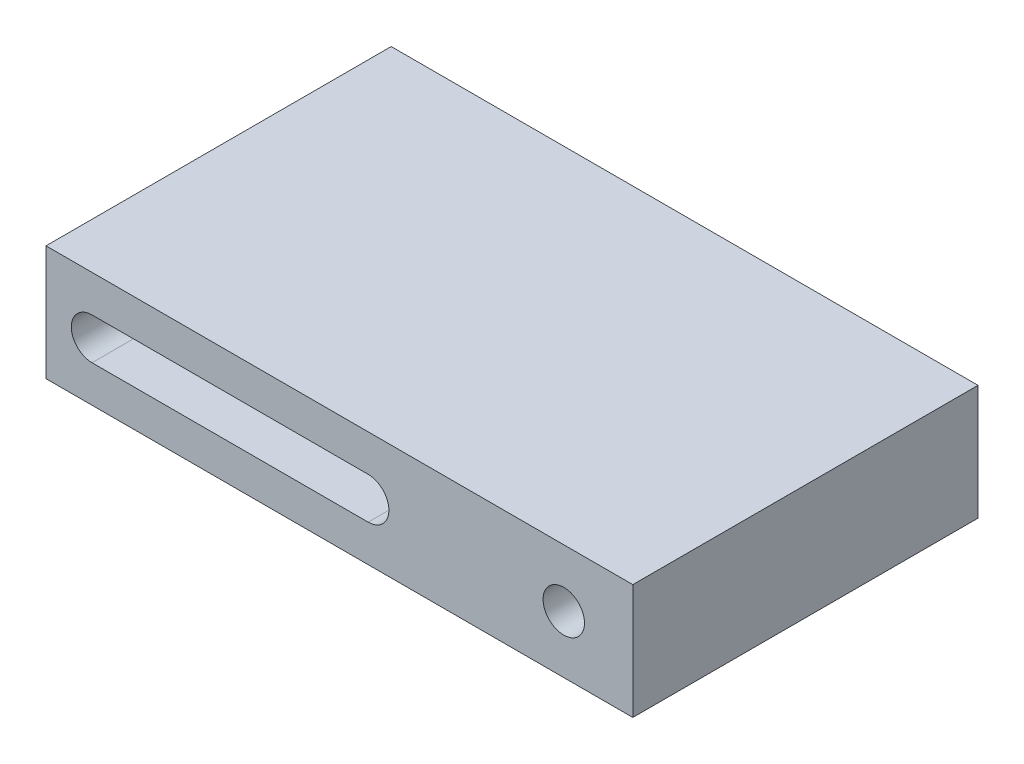
ISO-10303-21;
HEADER;
FILE_DESCRIPTION(('STEP AP214'),'2;1');
FILE_NAME('part.step','',(''),(''),'','','');
FILE_SCHEMA(('AUTOMOTIVE_DESIGN { 1 0 10303 214 1 1 1 1 }'));
ENDSEC;
DATA;
#1=APPLICATION_CONTEXT('core data for automotive mechanical design processes');
#2=APPLICATION_PROTOCOL_DEFINITION('international standard','automotive_design',2000,#1);
#3=PRODUCT_CONTEXT('',#1,'mechanical');
#4=PRODUCT('Part','Part','',(#3));
#5=PRODUCT_RELATED_PRODUCT_CATEGORY('part','',(#4));
#6=PRODUCT_DEFINITION_FORMATION('','',#4);
#7=PRODUCT_DEFINITION_CONTEXT('part definition',#1,'design');
#8=PRODUCT_DEFINITION('design','',#6,#7);
#9=PRODUCT_DEFINITION_SHAPE('','',#8);
#10=(LENGTH_UNIT() NAMED_UNIT(*) SI_UNIT(.MILLI.,.METRE.));
#11=(NAMED_UNIT(*) PLANE_ANGLE_UNIT() SI_UNIT($,.RADIAN.));
#12=(NAMED_UNIT(*) SI_UNIT($,.STERADIAN.) SOLID_ANGLE_UNIT());
#13=UNCERTAINTY_MEASURE_WITH_UNIT(LENGTH_MEASURE(1.E-05),#10,'distance_accuracy_value','');
#14=(GEOMETRIC_REPRESENTATION_CONTEXT(3) GLOBAL_UNCERTAINTY_ASSIGNED_CONTEXT((#13)) GLOBAL_UNIT_ASSIGNED_CONTEXT((#10,
#11,#12)) REPRESENTATION_CONTEXT('',''));
#15=CARTESIAN_POINT('',(0.,0.,0.));
#16=DIRECTION('',(0.,0.,1.));
#17=DIRECTION('',(1.,0.,0.));
#18=AXIS2_PLACEMENT_3D('',#15,#16,#17);
#19=CARTESIAN_POINT('',(1275.,500.,-750.));
#20=DIRECTION('',(-1.,0.,0.));
#21=DIRECTION('',(0.,0.,1.));
#22=AXIS2_PLACEMENT_3D('',#19,#20,#21);
#23=PLANE('',#22);
#24=DIRECTION('',(0.,0.,-1.));
#25=VECTOR('',#24,1.);
#26=CARTESIAN_POINT('',(1275.,0.,-750.));
#27=LINE('',#26,#25);
#28=CARTESIAN_POINT('',(1275.,0.,750.));
#29=VERTEX_POINT('',#28);
#30=CARTESIAN_POINT('',(1275.,0.,-750.));
#31=VERTEX_POINT('',#30);
#32=EDGE_CURVE('E135',#29,#31,#27,.T.);
#33=ORIENTED_EDGE('',*,*,#32,.T.);
#34=DIRECTION('',(0.,-1.,0.));
#35=VECTOR('',#34,1.);
#36=CARTESIAN_POINT('',(1275.,500.,-750.));
#37=LINE('',#36,#35);
#38=CARTESIAN_POINT('',(1275.,500.,-750.));
#39=VERTEX_POINT('',#38);
#40=EDGE_CURVE('E11',#39,#31,#37,.T.);
#41=ORIENTED_EDGE('',*,*,#40,.F.);
#42=DIRECTION('',(0.,0.,-1.));
#43=VECTOR('',#42,1.);
#44=CARTESIAN_POINT('',(1275.,500.,-750.));
#45=LINE('',#44,#43);
#46=CARTESIAN_POINT('',(1275.,500.,750.));
#47=VERTEX_POINT('',#46);
#48=EDGE_CURVE('E144',#47,#39,#45,.T.);
#49=ORIENTED_EDGE('',*,*,#48,.F.);
#50=DIRECTION('',(0.,-1.,0.));
#51=VECTOR('',#50,1.);
#52=CARTESIAN_POINT('',(1275.,500.,750.));
#53=LINE('',#52,#51);
#54=EDGE_CURVE('E154',#47,#29,#53,.T.);
#55=ORIENTED_EDGE('',*,*,#54,.T.);
#56=EDGE_LOOP('',(#33,#41,#49,#55));
#57=FACE_BOUND('',#56,.T.);
#58=ADVANCED_FACE('F37',(#57),#23,.F.);
#59=CARTESIAN_POINT('',(-1275.,500.,-750.));
#60=DIRECTION('',(0.,0.,1.));
#61=DIRECTION('',(1.,0.,0.));
#62=AXIS2_PLACEMENT_3D('',#59,#60,#61);
#63=PLANE('',#62);
#64=DIRECTION('',(-1.,0.,0.));
#65=VECTOR('',#64,1.);
#66=CARTESIAN_POINT('',(-1075.,340.,-750.));
#67=LINE('',#66,#65);
#68=CARTESIAN_POINT('',(125.,340.,-750.));
#69=VERTEX_POINT('',#68);
#70=CARTESIAN_POINT('',(-1075.,340.,-750.));
#71=VERTEX_POINT('',#70);
#72=EDGE_CURVE('E109',#69,#71,#67,.T.);
#73=ORIENTED_EDGE('',*,*,#72,.T.);
#74=CARTESIAN_POINT('',(-1075.,250.,-750.));
#75=DIRECTION('',(0.,0.,1.));
#76=DIRECTION('',(1.,0.,0.));
#77=AXIS2_PLACEMENT_3D('',#74,#75,#76);
#78=CIRCLE('',#77,90.);
#79=CARTESIAN_POINT('',(-1075.,160.,-750.));
#80=VERTEX_POINT('',#79);
#81=EDGE_CURVE('E103',#71,#80,#78,.T.);
#82=ORIENTED_EDGE('',*,*,#81,.T.);
#83=DIRECTION('',(1.,0.,0.));
#84=VECTOR('',#83,1.);
#85=CARTESIAN_POINT('',(-1075.,160.,-750.));
#86=LINE('',#85,#84);
#87=CARTESIAN_POINT('',(125.,160.,-750.));
#88=VERTEX_POINT('',#87);
#89=EDGE_CURVE('E112',#80,#88,#86,.T.);
#90=ORIENTED_EDGE('',*,*,#89,.T.);
#91=CARTESIAN_POINT('',(125.,250.,-750.));
#92=DIRECTION('',(0.,0.,1.));
#93=DIRECTION('',(1.,0.,0.));
#94=AXIS2_PLACEMENT_3D('',#91,#92,#93);
#95=CIRCLE('',#94,90.);
#96=EDGE_CURVE('E51',#88,#69,#95,.T.);
#97=ORIENTED_EDGE('',*,*,#96,.T.);
#98=EDGE_LOOP('',(#73,#82,#90,#97));
#99=FACE_BOUND('',#98,.T.);
#100=CARTESIAN_POINT('',(975.,250.,-750.));
#101=DIRECTION('',(0.,0.,1.));
#102=DIRECTION('',(1.,0.,0.));
#103=AXIS2_PLACEMENT_3D('',#100,#101,#102);
#104=CIRCLE('',#103,90.0000000000002);
#105=CARTESIAN_POINT('',(1065.,250.,-750.));
#106=VERTEX_POINT('',#105);
#107=EDGE_CURVE('E141',#106,#106,#104,.T.);
#108=ORIENTED_EDGE('',*,*,#107,.T.);
#109=EDGE_LOOP('',(#108));
#110=FACE_BOUND('',#109,.T.);
#111=DIRECTION('',(-1.,0.,0.));
#112=VECTOR('',#111,1.);
#113=CARTESIAN_POINT('',(-1275.,0.,-750.));
#114=LINE('',#113,#112);
#115=CARTESIAN_POINT('',(-1275.,0.,-750.));
#116=VERTEX_POINT('',#115);
#117=EDGE_CURVE('E157',#31,#116,#114,.T.);
#118=ORIENTED_EDGE('',*,*,#117,.T.);
#119=DIRECTION('',(0.,-1.,0.));
#120=VECTOR('',#119,1.);
#121=CARTESIAN_POINT('',(-1275.,500.,-750.));
#122=LINE('',#121,#120);
#123=CARTESIAN_POINT('',(-1275.,500.,-750.));
#124=VERTEX_POINT('',#123);
#125=EDGE_CURVE('E44',#124,#116,#122,.T.);
#126=ORIENTED_EDGE('',*,*,#125,.F.);
#127=DIRECTION('',(-1.,0.,0.));
#128=VECTOR('',#127,1.);
#129=CARTESIAN_POINT('',(-1275.,500.,-750.));
#130=LINE('',#129,#128);
#131=EDGE_CURVE('E147',#39,#124,#130,.T.);
#132=ORIENTED_EDGE('',*,*,#131,.F.);
#133=ORIENTED_EDGE('',*,*,#40,.T.);
#134=EDGE_LOOP('',(#118,#126,#132,#133));
#135=FACE_BOUND('',#134,.T.);
#136=ADVANCED_FACE('F116',(#99,#110,#135),#63,.F.);
#137=CARTESIAN_POINT('',(-1275.,500.,-750.));
#138=DIRECTION('',(1.,0.,0.));
#139=DIRECTION('',(0.,0.,-1.));
#140=AXIS2_PLACEMENT_3D('',#137,#138,#139);
#141=PLANE('',#140);
#142=DIRECTION('',(0.,0.,1.));
#143=VECTOR('',#142,1.);
#144=CARTESIAN_POINT('',(-1275.,0.,-750.));
#145=LINE('',#144,#143);
#146=CARTESIAN_POINT('',(-1275.,0.,750.));
#147=VERTEX_POINT('',#146);
#148=EDGE_CURVE('E159',#116,#147,#145,.T.);
#149=ORIENTED_EDGE('',*,*,#148,.T.);
#150=DIRECTION('',(0.,-1.,0.));
#151=VECTOR('',#150,1.);
#152=CARTESIAN_POINT('',(-1275.,500.,750.));
#153=LINE('',#152,#151);
#154=CARTESIAN_POINT('',(-1275.,500.,750.));
#155=VERTEX_POINT('',#154);
#156=EDGE_CURVE('E164',#155,#147,#153,.T.);
#157=ORIENTED_EDGE('',*,*,#156,.F.);
#158=DIRECTION('',(0.,0.,1.));
#159=VECTOR('',#158,1.);
#160=CARTESIAN_POINT('',(-1275.,500.,-750.));
#161=LINE('',#160,#159);
#162=EDGE_CURVE('E150',#124,#155,#161,.T.);
#163=ORIENTED_EDGE('',*,*,#162,.F.);
#164=ORIENTED_EDGE('',*,*,#125,.T.);
#165=EDGE_LOOP('',(#149,#157,#163,#164));
#166=FACE_BOUND('',#165,.T.);
#167=ADVANCED_FACE('F171',(#166),#141,.F.);
#168=CARTESIAN_POINT('',(-1275.,500.,750.));
#169=DIRECTION('',(0.,0.,-1.));
#170=DIRECTION('',(-1.,0.,0.));
#171=AXIS2_PLACEMENT_3D('',#168,#169,#170);
#172=PLANE('',#171);
#173=DIRECTION('',(1.,0.,0.));
#174=VECTOR('',#173,1.);
#175=CARTESIAN_POINT('',(-1075.,160.,750.));
#176=LINE('',#175,#174);
#177=CARTESIAN_POINT('',(-1075.,160.,750.));
#178=VERTEX_POINT('',#177);
#179=CARTESIAN_POINT('',(125.,160.,750.));
#180=VERTEX_POINT('',#179);
#181=EDGE_CURVE('E128',#178,#180,#176,.T.);
#182=ORIENTED_EDGE('',*,*,#181,.F.);
#183=CARTESIAN_POINT('',(-1075.,250.,750.));
#184=DIRECTION('',(0.,0.,1.));
#185=DIRECTION('',(1.,0.,0.));
#186=AXIS2_PLACEMENT_3D('',#183,#184,#185);
#187=CIRCLE('',#186,90.);
#188=CARTESIAN_POINT('',(-1075.,340.,750.));
#189=VERTEX_POINT('',#188);
#190=EDGE_CURVE('E59',#189,#178,#187,.T.);
#191=ORIENTED_EDGE('',*,*,#190,.F.);
#192=DIRECTION('',(-1.,0.,0.));
#193=VECTOR('',#192,1.);
#194=CARTESIAN_POINT('',(-1075.,340.,750.));
#195=LINE('',#194,#193);
#196=CARTESIAN_POINT('',(125.,340.,750.));
#197=VERTEX_POINT('',#196);
#198=EDGE_CURVE('E119',#197,#189,#195,.T.);
#199=ORIENTED_EDGE('',*,*,#198,.F.);
#200=CARTESIAN_POINT('',(125.,250.,750.));
#201=DIRECTION('',(0.,0.,1.));
#202=DIRECTION('',(1.,0.,0.));
#203=AXIS2_PLACEMENT_3D('',#200,#201,#202);
#204=CIRCLE('',#203,90.);
#205=EDGE_CURVE('E122',#180,#197,#204,.T.);
#206=ORIENTED_EDGE('',*,*,#205,.F.);
#207=EDGE_LOOP('',(#182,#191,#199,#206));
#208=FACE_BOUND('',#207,.T.);
#209=CARTESIAN_POINT('',(975.,250.,750.));
#210=DIRECTION('',(0.,0.,1.));
#211=DIRECTION('',(1.,0.,0.));
#212=AXIS2_PLACEMENT_3D('',#209,#210,#211);
#213=CIRCLE('',#212,90.0000000000002);
#214=CARTESIAN_POINT('',(1065.,250.,750.));
#215=VERTEX_POINT('',#214);
#216=EDGE_CURVE('E129',#215,#215,#213,.T.);
#217=ORIENTED_EDGE('',*,*,#216,.F.);
#218=EDGE_LOOP('',(#217));
#219=FACE_BOUND('',#218,.T.);
#220=DIRECTION('',(1.,0.,0.));
#221=VECTOR('',#220,1.);
#222=CARTESIAN_POINT('',(-1275.,0.,750.));
#223=LINE('',#222,#221);
#224=EDGE_CURVE('E148',#147,#29,#223,.T.);
#225=ORIENTED_EDGE('',*,*,#224,.T.);
#226=ORIENTED_EDGE('',*,*,#54,.F.);
#227=DIRECTION('',(1.,0.,0.));
#228=VECTOR('',#227,1.);
#229=CARTESIAN_POINT('',(-1275.,500.,750.));
#230=LINE('',#229,#228);
#231=EDGE_CURVE('E152',#155,#47,#230,.T.);
#232=ORIENTED_EDGE('',*,*,#231,.F.);
#233=ORIENTED_EDGE('',*,*,#156,.T.);
#234=EDGE_LOOP('',(#225,#226,#232,#233));
#235=FACE_BOUND('',#234,.T.);
#236=ADVANCED_FACE('F180',(#208,#219,#235),#172,.F.);
#237=CARTESIAN_POINT('',(0.,500.,0.));
#238=DIRECTION('',(0.,1.,0.));
#239=DIRECTION('',(0.,0.,1.));
#240=AXIS2_PLACEMENT_3D('',#237,#238,#239);
#241=PLANE('',#240);
#242=ORIENTED_EDGE('',*,*,#48,.T.);
#243=ORIENTED_EDGE('',*,*,#131,.T.);
#244=ORIENTED_EDGE('',*,*,#162,.T.);
#245=ORIENTED_EDGE('',*,*,#231,.T.);
#246=EDGE_LOOP('',(#242,#243,#244,#245));
#247=FACE_BOUND('',#246,.T.);
#248=ADVANCED_FACE('F186',(#247),#241,.T.);
#249=CARTESIAN_POINT('',(0.,0.,0.));
#250=DIRECTION('',(0.,1.,0.));
#251=DIRECTION('',(0.,0.,1.));
#252=AXIS2_PLACEMENT_3D('',#249,#250,#251);
#253=PLANE('',#252);
#254=ORIENTED_EDGE('',*,*,#32,.F.);
#255=ORIENTED_EDGE('',*,*,#224,.F.);
#256=ORIENTED_EDGE('',*,*,#148,.F.);
#257=ORIENTED_EDGE('',*,*,#117,.F.);
#258=EDGE_LOOP('',(#254,#255,#256,#257));
#259=FACE_BOUND('',#258,.T.);
#260=ADVANCED_FACE('F177',(#259),#253,.F.);
#261=CARTESIAN_POINT('',(975.,250.,-750.));
#262=DIRECTION('',(0.,0.,1.));
#263=DIRECTION('',(1.,0.,0.));
#264=AXIS2_PLACEMENT_3D('',#261,#262,#263);
#265=CYLINDRICAL_SURFACE('',#264,90.0000000000002);
#266=ORIENTED_EDGE('',*,*,#107,.F.);
#267=EDGE_LOOP('',(#266));
#268=FACE_BOUND('',#267,.T.);
#269=ORIENTED_EDGE('',*,*,#216,.T.);
#270=EDGE_LOOP('',(#269));
#271=FACE_BOUND('',#270,.T.);
#272=ADVANCED_FACE('F199',(#268,#271),#265,.F.);
#273=CARTESIAN_POINT('',(-1075.,250.,-750.));
#274=DIRECTION('',(0.,0.,1.));
#275=DIRECTION('',(1.,0.,0.));
#276=AXIS2_PLACEMENT_3D('',#273,#274,#275);
#277=CYLINDRICAL_SURFACE('',#276,90.);
#278=ORIENTED_EDGE('',*,*,#190,.T.);
#279=DIRECTION('',(0.,0.,1.));
#280=VECTOR('',#279,1.);
#281=CARTESIAN_POINT('',(-1075.,160.,-750.));
#282=LINE('',#281,#280);
#283=EDGE_CURVE('E99',#80,#178,#282,.T.);
#284=ORIENTED_EDGE('',*,*,#283,.F.);
#285=ORIENTED_EDGE('',*,*,#81,.F.);
#286=DIRECTION('',(0.,0.,1.));
#287=VECTOR('',#286,1.);
#288=CARTESIAN_POINT('',(-1075.,340.,-750.));
#289=LINE('',#288,#287);
#290=EDGE_CURVE('E133',#71,#189,#289,.T.);
#291=ORIENTED_EDGE('',*,*,#290,.T.);
#292=EDGE_LOOP('',(#278,#284,#285,#291));
#293=FACE_BOUND('',#292,.T.);
#294=ADVANCED_FACE('F101',(#293),#277,.F.);
#295=CARTESIAN_POINT('',(-1075.,340.,-750.));
#296=DIRECTION('',(0.,1.,0.));
#297=DIRECTION('',(0.,0.,1.));
#298=AXIS2_PLACEMENT_3D('',#295,#296,#297);
#299=PLANE('',#298);
#300=ORIENTED_EDGE('',*,*,#198,.T.);
#301=ORIENTED_EDGE('',*,*,#290,.F.);
#302=ORIENTED_EDGE('',*,*,#72,.F.);
#303=DIRECTION('',(0.,0.,1.));
#304=VECTOR('',#303,1.);
#305=CARTESIAN_POINT('',(125.,340.,-750.));
#306=LINE('',#305,#304);
#307=EDGE_CURVE('E136',#69,#197,#306,.T.);
#308=ORIENTED_EDGE('',*,*,#307,.T.);
#309=EDGE_LOOP('',(#300,#301,#302,#308));
#310=FACE_BOUND('',#309,.T.);
#311=ADVANCED_FACE('F207',(#310),#299,.F.);
#312=CARTESIAN_POINT('',(125.,250.,-750.));
#313=DIRECTION('',(0.,0.,1.));
#314=DIRECTION('',(1.,0.,0.));
#315=AXIS2_PLACEMENT_3D('',#312,#313,#314);
#316=CYLINDRICAL_SURFACE('',#315,90.);
#317=ORIENTED_EDGE('',*,*,#205,.T.);
#318=ORIENTED_EDGE('',*,*,#307,.F.);
#319=ORIENTED_EDGE('',*,*,#96,.F.);
#320=DIRECTION('',(0.,0.,1.));
#321=VECTOR('',#320,1.);
#322=CARTESIAN_POINT('',(125.,160.,-750.));
#323=LINE('',#322,#321);
#324=EDGE_CURVE('E108',#88,#180,#323,.T.);
#325=ORIENTED_EDGE('',*,*,#324,.T.);
#326=EDGE_LOOP('',(#317,#318,#319,#325));
#327=FACE_BOUND('',#326,.T.);
#328=ADVANCED_FACE('F210',(#327),#316,.F.);
#329=CARTESIAN_POINT('',(-1075.,160.,-750.));
#330=DIRECTION('',(0.,-1.,0.));
#331=DIRECTION('',(0.,0.,-1.));
#332=AXIS2_PLACEMENT_3D('',#329,#330,#331);
#333=PLANE('',#332);
#334=ORIENTED_EDGE('',*,*,#181,.T.);
#335=ORIENTED_EDGE('',*,*,#324,.F.);
#336=ORIENTED_EDGE('',*,*,#89,.F.);
#337=ORIENTED_EDGE('',*,*,#283,.T.);
#338=EDGE_LOOP('',(#334,#335,#336,#337));
#339=FACE_BOUND('',#338,.T.);
#340=ADVANCED_FACE('F113',(#339),#333,.F.);
#341=CLOSED_SHELL('',(#58,#136,#167,#236,#248,#260,#272,#294,#311,#328,#340));
#342=MANIFOLD_SOLID_BREP('B2',#341);
#343=ADVANCED_BREP_SHAPE_REPRESENTATION('',(#18,#342),#14);
#344=SHAPE_DEFINITION_REPRESENTATION(#9,#343);
ENDSEC;
END-ISO-10303-21;
